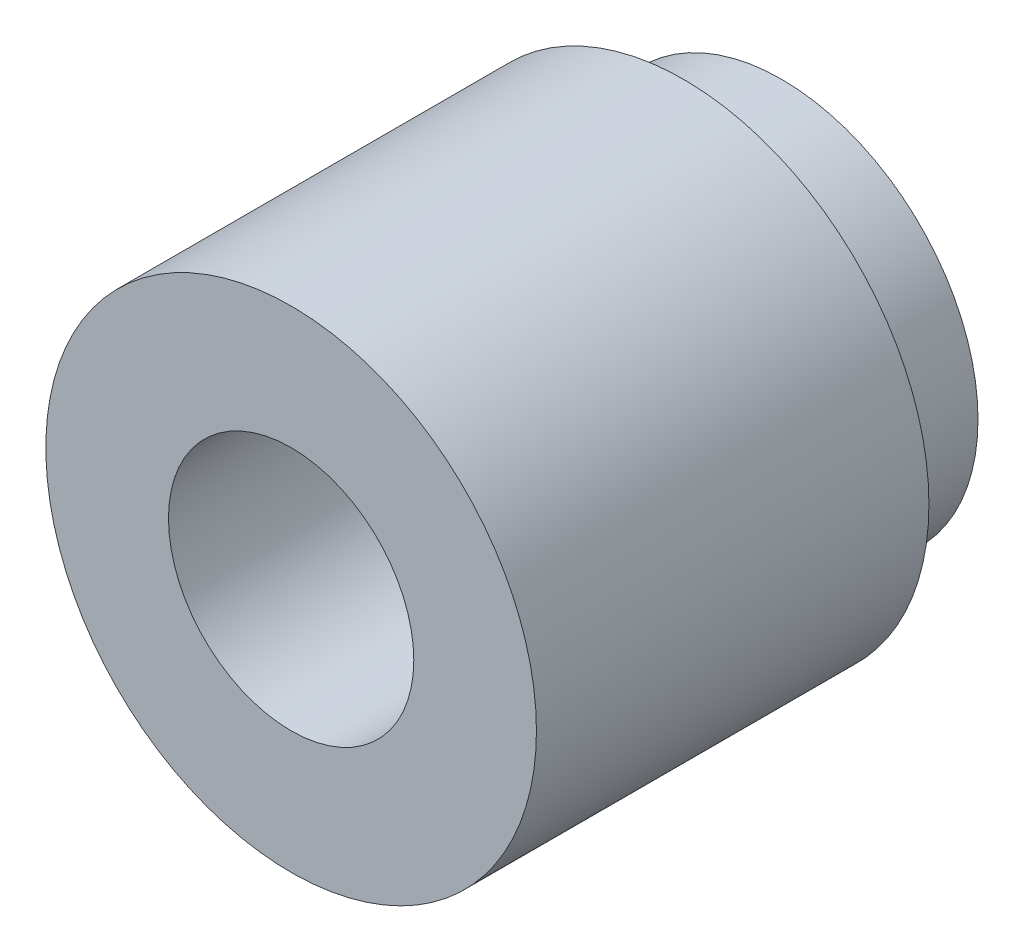
ISO-10303-21;
HEADER;
FILE_DESCRIPTION(('STEP AP214'),'2;1');
FILE_NAME('part.step','',(''),(''),'','','');
FILE_SCHEMA(('AUTOMOTIVE_DESIGN { 1 0 10303 214 1 1 1 1 }'));
ENDSEC;
DATA;
#1=APPLICATION_CONTEXT('core data for automotive mechanical design processes');
#2=APPLICATION_PROTOCOL_DEFINITION('international standard','automotive_design',2000,#1);
#3=PRODUCT_CONTEXT('',#1,'mechanical');
#4=PRODUCT('Part','Part','',(#3));
#5=PRODUCT_RELATED_PRODUCT_CATEGORY('part','',(#4));
#6=PRODUCT_DEFINITION_FORMATION('','',#4);
#7=PRODUCT_DEFINITION_CONTEXT('part definition',#1,'design');
#8=PRODUCT_DEFINITION('design','',#6,#7);
#9=PRODUCT_DEFINITION_SHAPE('','',#8);
#10=(LENGTH_UNIT() NAMED_UNIT(*) SI_UNIT(.MILLI.,.METRE.));
#11=(NAMED_UNIT(*) PLANE_ANGLE_UNIT() SI_UNIT($,.RADIAN.));
#12=(NAMED_UNIT(*) SI_UNIT($,.STERADIAN.) SOLID_ANGLE_UNIT());
#13=UNCERTAINTY_MEASURE_WITH_UNIT(LENGTH_MEASURE(1.E-05),#10,'distance_accuracy_value','');
#14=(GEOMETRIC_REPRESENTATION_CONTEXT(3) GLOBAL_UNCERTAINTY_ASSIGNED_CONTEXT((#13)) GLOBAL_UNIT_ASSIGNED_CONTEXT((#10,
#11,#12)) REPRESENTATION_CONTEXT('',''));
#15=CARTESIAN_POINT('',(0.,0.,0.));
#16=DIRECTION('',(0.,0.,1.));
#17=DIRECTION('',(1.,0.,0.));
#18=AXIS2_PLACEMENT_3D('',#15,#16,#17);
#19=CARTESIAN_POINT('',(0.,0.,0.));
#20=DIRECTION('',(0.,0.,1.));
#21=DIRECTION('',(1.,0.,0.));
#22=AXIS2_PLACEMENT_3D('',#19,#20,#21);
#23=PLANE('',#22);
#24=CARTESIAN_POINT('',(0.,0.,0.));
#25=DIRECTION('',(0.,0.,1.));
#26=DIRECTION('',(1.,0.,0.));
#27=AXIS2_PLACEMENT_3D('',#24,#25,#26);
#28=CIRCLE('',#27,2.5);
#29=CARTESIAN_POINT('',(2.5,0.,0.));
#30=VERTEX_POINT('',#29);
#31=EDGE_CURVE('E44',#30,#30,#28,.T.);
#32=ORIENTED_EDGE('',*,*,#31,.F.);
#33=EDGE_LOOP('',(#32));
#34=FACE_BOUND('',#33,.T.);
#35=CARTESIAN_POINT('',(0.,0.,0.));
#36=DIRECTION('',(0.,0.,1.));
#37=DIRECTION('',(1.,0.,0.));
#38=AXIS2_PLACEMENT_3D('',#35,#36,#37);
#39=CIRCLE('',#38,2.);
#40=CARTESIAN_POINT('',(2.,0.,0.));
#41=VERTEX_POINT('',#40);
#42=EDGE_CURVE('E10',#41,#41,#39,.F.);
#43=ORIENTED_EDGE('',*,*,#42,.F.);
#44=EDGE_LOOP('',(#43));
#45=FACE_BOUND('',#44,.T.);
#46=ADVANCED_FACE('F33',(#34,#45),#23,.F.);
#47=CARTESIAN_POINT('',(0.,0.,4.));
#48=DIRECTION('',(0.,0.,1.));
#49=DIRECTION('',(1.,0.,0.));
#50=AXIS2_PLACEMENT_3D('',#47,#48,#49);
#51=PLANE('',#50);
#52=CARTESIAN_POINT('',(0.,0.,4.));
#53=DIRECTION('',(0.,0.,1.));
#54=DIRECTION('',(1.,0.,0.));
#55=AXIS2_PLACEMENT_3D('',#52,#53,#54);
#56=CIRCLE('',#55,2.5);
#57=CARTESIAN_POINT('',(2.5,0.,4.));
#58=VERTEX_POINT('',#57);
#59=EDGE_CURVE('E40',#58,#58,#56,.T.);
#60=ORIENTED_EDGE('',*,*,#59,.T.);
#61=EDGE_LOOP('',(#60));
#62=FACE_BOUND('',#61,.T.);
#63=CARTESIAN_POINT('',(0.,0.,4.));
#64=DIRECTION('',(0.,0.,1.));
#65=DIRECTION('',(1.,0.,0.));
#66=AXIS2_PLACEMENT_3D('',#63,#64,#65);
#67=CIRCLE('',#66,1.25);
#68=CARTESIAN_POINT('',(1.25,0.,4.));
#69=VERTEX_POINT('',#68);
#70=EDGE_CURVE('E49',#69,#69,#67,.T.);
#71=ORIENTED_EDGE('',*,*,#70,.F.);
#72=EDGE_LOOP('',(#71));
#73=FACE_BOUND('',#72,.T.);
#74=ADVANCED_FACE('F76',(#62,#73),#51,.T.);
#75=CARTESIAN_POINT('',(0.,0.,4.));
#76=DIRECTION('',(0.,0.,-1.));
#77=DIRECTION('',(-1.,0.,0.));
#78=AXIS2_PLACEMENT_3D('',#75,#76,#77);
#79=CYLINDRICAL_SURFACE('',#78,2.5);
#80=ORIENTED_EDGE('',*,*,#59,.F.);
#81=EDGE_LOOP('',(#80));
#82=FACE_BOUND('',#81,.T.);
#83=ORIENTED_EDGE('',*,*,#31,.T.);
#84=EDGE_LOOP('',(#83));
#85=FACE_BOUND('',#84,.T.);
#86=ADVANCED_FACE('F35',(#82,#85),#79,.T.);
#87=CARTESIAN_POINT('',(0.,0.,4.));
#88=DIRECTION('',(0.,0.,-1.));
#89=DIRECTION('',(-1.,0.,0.));
#90=AXIS2_PLACEMENT_3D('',#87,#88,#89);
#91=CYLINDRICAL_SURFACE('',#90,1.25);
#92=ORIENTED_EDGE('',*,*,#70,.T.);
#93=EDGE_LOOP('',(#92));
#94=FACE_BOUND('',#93,.T.);
#95=CARTESIAN_POINT('',(0.,0.,-1.));
#96=DIRECTION('',(0.,0.,-1.));
#97=DIRECTION('',(-1.,0.,0.));
#98=AXIS2_PLACEMENT_3D('',#95,#96,#97);
#99=CIRCLE('',#98,1.25);
#100=CARTESIAN_POINT('',(-1.25,0.,-1.));
#101=VERTEX_POINT('',#100);
#102=EDGE_CURVE('E56',#101,#101,#99,.T.);
#103=ORIENTED_EDGE('',*,*,#102,.T.);
#104=EDGE_LOOP('',(#103));
#105=FACE_BOUND('',#104,.T.);
#106=ADVANCED_FACE('F60',(#94,#105),#91,.F.);
#107=CARTESIAN_POINT('',(0.,0.,-1.));
#108=DIRECTION('',(0.,0.,-1.));
#109=DIRECTION('',(-1.,0.,0.));
#110=AXIS2_PLACEMENT_3D('',#107,#108,#109);
#111=PLANE('',#110);
#112=CARTESIAN_POINT('',(0.,0.,-1.));
#113=DIRECTION('',(0.,0.,-1.));
#114=DIRECTION('',(-1.,0.,0.));
#115=AXIS2_PLACEMENT_3D('',#112,#113,#114);
#116=CIRCLE('',#115,2.);
#117=CARTESIAN_POINT('',(-2.,0.,-1.));
#118=VERTEX_POINT('',#117);
#119=EDGE_CURVE('E53',#118,#118,#116,.T.);
#120=ORIENTED_EDGE('',*,*,#119,.T.);
#121=EDGE_LOOP('',(#120));
#122=FACE_BOUND('',#121,.T.);
#123=ORIENTED_EDGE('',*,*,#102,.F.);
#124=EDGE_LOOP('',(#123));
#125=FACE_BOUND('',#124,.T.);
#126=ADVANCED_FACE('F62',(#122,#125),#111,.T.);
#127=CARTESIAN_POINT('',(0.,0.,-1.));
#128=DIRECTION('',(0.,0.,1.));
#129=DIRECTION('',(1.,0.,0.));
#130=AXIS2_PLACEMENT_3D('',#127,#128,#129);
#131=CYLINDRICAL_SURFACE('',#130,2.);
#132=ORIENTED_EDGE('',*,*,#119,.F.);
#133=EDGE_LOOP('',(#132));
#134=FACE_BOUND('',#133,.T.);
#135=ORIENTED_EDGE('',*,*,#42,.T.);
#136=EDGE_LOOP('',(#135));
#137=FACE_BOUND('',#136,.T.);
#138=ADVANCED_FACE('F64',(#134,#137),#131,.T.);
#139=CLOSED_SHELL('',(#46,#74,#86,#106,#126,#138));
#140=MANIFOLD_SOLID_BREP('B2',#139);
#141=ADVANCED_BREP_SHAPE_REPRESENTATION('',(#18,#140),#14);
#142=SHAPE_DEFINITION_REPRESENTATION(#9,#141);
ENDSEC;
END-ISO-10303-21;
